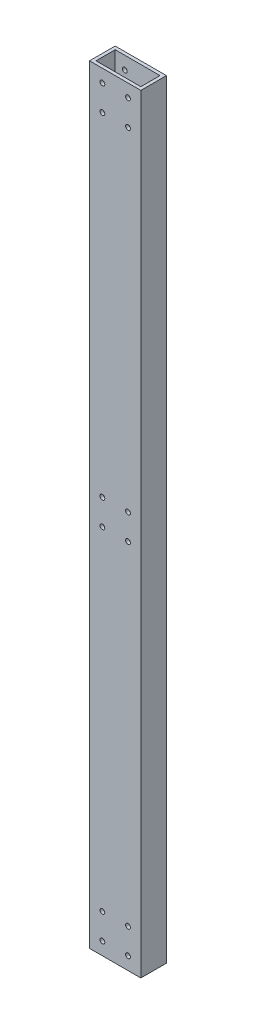
ISO-10303-21;
HEADER;
FILE_DESCRIPTION(('STEP AP214'),'2;1');
FILE_NAME('part.step','',(''),(''),'','','');
FILE_SCHEMA(('AUTOMOTIVE_DESIGN { 1 0 10303 214 1 1 1 1 }'));
ENDSEC;
DATA;
#1=APPLICATION_CONTEXT('core data for automotive mechanical design processes');
#2=APPLICATION_PROTOCOL_DEFINITION('international standard','automotive_design',2000,#1);
#3=PRODUCT_CONTEXT('',#1,'mechanical');
#4=PRODUCT('Part','Part','',(#3));
#5=PRODUCT_RELATED_PRODUCT_CATEGORY('part','',(#4));
#6=PRODUCT_DEFINITION_FORMATION('','',#4);
#7=PRODUCT_DEFINITION_CONTEXT('part definition',#1,'design');
#8=PRODUCT_DEFINITION('design','',#6,#7);
#9=PRODUCT_DEFINITION_SHAPE('','',#8);
#10=(LENGTH_UNIT() NAMED_UNIT(*) SI_UNIT(.MILLI.,.METRE.));
#11=(NAMED_UNIT(*) PLANE_ANGLE_UNIT() SI_UNIT($,.RADIAN.));
#12=(NAMED_UNIT(*) SI_UNIT($,.STERADIAN.) SOLID_ANGLE_UNIT());
#13=UNCERTAINTY_MEASURE_WITH_UNIT(LENGTH_MEASURE(1.E-05),#10,'distance_accuracy_value','');
#14=(GEOMETRIC_REPRESENTATION_CONTEXT(3) GLOBAL_UNCERTAINTY_ASSIGNED_CONTEXT((#13)) GLOBAL_UNIT_ASSIGNED_CONTEXT((#10,
#11,#12)) REPRESENTATION_CONTEXT('',''));
#15=CARTESIAN_POINT('',(0.,0.,0.));
#16=DIRECTION('',(0.,0.,1.));
#17=DIRECTION('',(1.,0.,0.));
#18=AXIS2_PLACEMENT_3D('',#15,#16,#17);
#19=CARTESIAN_POINT('',(0.,381.,0.));
#20=DIRECTION('',(0.,-1.,0.));
#21=DIRECTION('',(0.,0.,-1.));
#22=AXIS2_PLACEMENT_3D('',#19,#20,#21);
#23=PLANE('',#22);
#24=DIRECTION('',(0.,0.,1.));
#25=VECTOR('',#24,1.);
#26=CARTESIAN_POINT('',(-25.4,381.,-12.7));
#27=LINE('',#26,#25);
#28=CARTESIAN_POINT('',(-25.4,381.,-12.7));
#29=VERTEX_POINT('',#28);
#30=CARTESIAN_POINT('',(-25.4,381.,12.7));
#31=VERTEX_POINT('',#30);
#32=EDGE_CURVE('E137',#29,#31,#27,.T.);
#33=ORIENTED_EDGE('',*,*,#32,.T.);
#34=DIRECTION('',(1.,0.,0.));
#35=VECTOR('',#34,1.);
#36=CARTESIAN_POINT('',(25.4,381.,12.7));
#37=LINE('',#36,#35);
#38=CARTESIAN_POINT('',(25.4,381.,12.7));
#39=VERTEX_POINT('',#38);
#40=EDGE_CURVE('E140',#31,#39,#37,.T.);
#41=ORIENTED_EDGE('',*,*,#40,.T.);
#42=DIRECTION('',(0.,0.,-1.));
#43=VECTOR('',#42,1.);
#44=CARTESIAN_POINT('',(25.4,381.,-12.7));
#45=LINE('',#44,#43);
#46=CARTESIAN_POINT('',(25.4,381.,-12.7));
#47=VERTEX_POINT('',#46);
#48=EDGE_CURVE('E143',#39,#47,#45,.T.);
#49=ORIENTED_EDGE('',*,*,#48,.T.);
#50=DIRECTION('',(-1.,0.,0.));
#51=VECTOR('',#50,1.);
#52=CARTESIAN_POINT('',(25.4,381.,-12.7));
#53=LINE('',#52,#51);
#54=EDGE_CURVE('E145',#47,#29,#53,.T.);
#55=ORIENTED_EDGE('',*,*,#54,.T.);
#56=EDGE_LOOP('',(#33,#41,#49,#55));
#57=FACE_BOUND('',#56,.T.);
#58=DIRECTION('',(0.,0.,1.));
#59=VECTOR('',#58,1.);
#60=CARTESIAN_POINT('',(-22.225,381.,0.));
#61=LINE('',#60,#59);
#62=CARTESIAN_POINT('',(-22.225,381.,-9.52500000000001));
#63=VERTEX_POINT('',#62);
#64=CARTESIAN_POINT('',(-22.225,381.,9.52500000000001));
#65=VERTEX_POINT('',#64);
#66=EDGE_CURVE('E125',#63,#65,#61,.T.);
#67=ORIENTED_EDGE('',*,*,#66,.F.);
#68=DIRECTION('',(-1.,0.,0.));
#69=VECTOR('',#68,1.);
#70=CARTESIAN_POINT('',(0.,381.,-9.52500000000001));
#71=LINE('',#70,#69);
#72=CARTESIAN_POINT('',(22.225,381.,-9.52500000000001));
#73=VERTEX_POINT('',#72);
#74=EDGE_CURVE('E109',#73,#63,#71,.T.);
#75=ORIENTED_EDGE('',*,*,#74,.F.);
#76=DIRECTION('',(0.,0.,-1.));
#77=VECTOR('',#76,1.);
#78=CARTESIAN_POINT('',(22.225,381.,0.));
#79=LINE('',#78,#77);
#80=CARTESIAN_POINT('',(22.225,381.,9.52500000000001));
#81=VERTEX_POINT('',#80);
#82=EDGE_CURVE('E134',#81,#73,#79,.T.);
#83=ORIENTED_EDGE('',*,*,#82,.F.);
#84=DIRECTION('',(1.,0.,0.));
#85=VECTOR('',#84,1.);
#86=CARTESIAN_POINT('',(0.,381.,9.52500000000001));
#87=LINE('',#86,#85);
#88=EDGE_CURVE('E127',#65,#81,#87,.T.);
#89=ORIENTED_EDGE('',*,*,#88,.F.);
#90=EDGE_LOOP('',(#67,#75,#83,#89));
#91=FACE_BOUND('',#90,.T.);
#92=ADVANCED_FACE('F37',(#57,#91),#23,.F.);
#93=CARTESIAN_POINT('',(0.,-381.,0.));
#94=DIRECTION('',(0.,-1.,0.));
#95=DIRECTION('',(0.,0.,-1.));
#96=AXIS2_PLACEMENT_3D('',#93,#94,#95);
#97=PLANE('',#96);
#98=DIRECTION('',(0.,0.,1.));
#99=VECTOR('',#98,1.);
#100=CARTESIAN_POINT('',(-25.4,-381.,-12.7));
#101=LINE('',#100,#99);
#102=CARTESIAN_POINT('',(-25.4,-381.,-12.7));
#103=VERTEX_POINT('',#102);
#104=CARTESIAN_POINT('',(-25.4,-381.,12.7));
#105=VERTEX_POINT('',#104);
#106=EDGE_CURVE('E148',#103,#105,#101,.T.);
#107=ORIENTED_EDGE('',*,*,#106,.F.);
#108=DIRECTION('',(-1.,0.,0.));
#109=VECTOR('',#108,1.);
#110=CARTESIAN_POINT('',(25.4,-381.,-12.7));
#111=LINE('',#110,#109);
#112=CARTESIAN_POINT('',(25.4,-381.,-12.7));
#113=VERTEX_POINT('',#112);
#114=EDGE_CURVE('E141',#113,#103,#111,.T.);
#115=ORIENTED_EDGE('',*,*,#114,.F.);
#116=DIRECTION('',(0.,0.,-1.));
#117=VECTOR('',#116,1.);
#118=CARTESIAN_POINT('',(25.4,-381.,-12.7));
#119=LINE('',#118,#117);
#120=CARTESIAN_POINT('',(25.4,-381.,12.7));
#121=VERTEX_POINT('',#120);
#122=EDGE_CURVE('E153',#121,#113,#119,.T.);
#123=ORIENTED_EDGE('',*,*,#122,.F.);
#124=DIRECTION('',(1.,0.,0.));
#125=VECTOR('',#124,1.);
#126=CARTESIAN_POINT('',(25.4,-381.,12.7));
#127=LINE('',#126,#125);
#128=EDGE_CURVE('E151',#105,#121,#127,.T.);
#129=ORIENTED_EDGE('',*,*,#128,.F.);
#130=EDGE_LOOP('',(#107,#115,#123,#129));
#131=FACE_BOUND('',#130,.T.);
#132=DIRECTION('',(-1.,0.,0.));
#133=VECTOR('',#132,1.);
#134=CARTESIAN_POINT('',(0.,-381.,-9.52500000000001));
#135=LINE('',#134,#133);
#136=CARTESIAN_POINT('',(22.225,-381.,-9.52500000000001));
#137=VERTEX_POINT('',#136);
#138=CARTESIAN_POINT('',(-22.225,-381.,-9.52500000000001));
#139=VERTEX_POINT('',#138);
#140=EDGE_CURVE('E107',#137,#139,#135,.T.);
#141=ORIENTED_EDGE('',*,*,#140,.T.);
#142=DIRECTION('',(0.,0.,1.));
#143=VECTOR('',#142,1.);
#144=CARTESIAN_POINT('',(-22.225,-381.,0.));
#145=LINE('',#144,#143);
#146=CARTESIAN_POINT('',(-22.225,-381.,9.52500000000001));
#147=VERTEX_POINT('',#146);
#148=EDGE_CURVE('E115',#139,#147,#145,.T.);
#149=ORIENTED_EDGE('',*,*,#148,.T.);
#150=DIRECTION('',(1.,0.,0.));
#151=VECTOR('',#150,1.);
#152=CARTESIAN_POINT('',(0.,-381.,9.52500000000001));
#153=LINE('',#152,#151);
#154=CARTESIAN_POINT('',(22.225,-381.,9.52500000000001));
#155=VERTEX_POINT('',#154);
#156=EDGE_CURVE('E121',#147,#155,#153,.T.);
#157=ORIENTED_EDGE('',*,*,#156,.T.);
#158=DIRECTION('',(0.,0.,-1.));
#159=VECTOR('',#158,1.);
#160=CARTESIAN_POINT('',(22.225,-381.,0.));
#161=LINE('',#160,#159);
#162=EDGE_CURVE('E61',#155,#137,#161,.T.);
#163=ORIENTED_EDGE('',*,*,#162,.T.);
#164=EDGE_LOOP('',(#141,#149,#157,#163));
#165=FACE_BOUND('',#164,.T.);
#166=ADVANCED_FACE('F124',(#131,#165),#97,.T.);
#167=CARTESIAN_POINT('',(-25.4,381.,-12.7));
#168=DIRECTION('',(1.,0.,0.));
#169=DIRECTION('',(0.,0.,-1.));
#170=AXIS2_PLACEMENT_3D('',#167,#168,#169);
#171=PLANE('',#170);
#172=ORIENTED_EDGE('',*,*,#106,.T.);
#173=DIRECTION('',(0.,-1.,0.));
#174=VECTOR('',#173,1.);
#175=CARTESIAN_POINT('',(-25.4,381.,12.7));
#176=LINE('',#175,#174);
#177=EDGE_CURVE('E11',#31,#105,#176,.T.);
#178=ORIENTED_EDGE('',*,*,#177,.F.);
#179=ORIENTED_EDGE('',*,*,#32,.F.);
#180=DIRECTION('',(0.,-1.,0.));
#181=VECTOR('',#180,1.);
#182=CARTESIAN_POINT('',(-25.4,381.,-12.7));
#183=LINE('',#182,#181);
#184=EDGE_CURVE('E147',#29,#103,#183,.T.);
#185=ORIENTED_EDGE('',*,*,#184,.T.);
#186=EDGE_LOOP('',(#172,#178,#179,#185));
#187=FACE_BOUND('',#186,.T.);
#188=ADVANCED_FACE('F39',(#187),#171,.F.);
#189=CARTESIAN_POINT('',(25.4,381.,12.7));
#190=DIRECTION('',(0.,0.,-1.));
#191=DIRECTION('',(-1.,0.,0.));
#192=AXIS2_PLACEMENT_3D('',#189,#190,#191);
#193=PLANE('',#192);
#194=CARTESIAN_POINT('',(-12.7,12.7,12.7));
#195=DIRECTION('',(0.,0.,1.));
#196=DIRECTION('',(1.,0.,0.));
#197=AXIS2_PLACEMENT_3D('',#194,#195,#196);
#198=CIRCLE('',#197,2.38125);
#199=CARTESIAN_POINT('',(-10.31875,12.7,12.7));
#200=VERTEX_POINT('',#199);
#201=EDGE_CURVE('E265',#200,#200,#198,.T.);
#202=ORIENTED_EDGE('',*,*,#201,.F.);
#203=EDGE_LOOP('',(#202));
#204=FACE_BOUND('',#203,.T.);
#205=CARTESIAN_POINT('',(-12.7,-368.3,12.7));
#206=DIRECTION('',(0.,0.,1.));
#207=DIRECTION('',(-1.,0.,0.));
#208=AXIS2_PLACEMENT_3D('',#205,#206,#207);
#209=CIRCLE('',#208,2.38125000000003);
#210=CARTESIAN_POINT('',(-15.08125,-368.3,12.7));
#211=VERTEX_POINT('',#210);
#212=EDGE_CURVE('E269',#211,#211,#209,.T.);
#213=ORIENTED_EDGE('',*,*,#212,.F.);
#214=EDGE_LOOP('',(#213));
#215=FACE_BOUND('',#214,.T.);
#216=CARTESIAN_POINT('',(12.7,-368.3,12.7));
#217=DIRECTION('',(0.,0.,1.));
#218=DIRECTION('',(-1.,0.,0.));
#219=AXIS2_PLACEMENT_3D('',#216,#217,#218);
#220=CIRCLE('',#219,2.38125000000003);
#221=CARTESIAN_POINT('',(10.31875,-368.3,12.7));
#222=VERTEX_POINT('',#221);
#223=EDGE_CURVE('E273',#222,#222,#220,.T.);
#224=ORIENTED_EDGE('',*,*,#223,.F.);
#225=EDGE_LOOP('',(#224));
#226=FACE_BOUND('',#225,.T.);
#227=CARTESIAN_POINT('',(12.7,-342.9,12.7));
#228=DIRECTION('',(0.,0.,1.));
#229=DIRECTION('',(-1.,0.,0.));
#230=AXIS2_PLACEMENT_3D('',#227,#228,#229);
#231=CIRCLE('',#230,2.38125000000003);
#232=CARTESIAN_POINT('',(10.31875,-342.9,12.7));
#233=VERTEX_POINT('',#232);
#234=EDGE_CURVE('E277',#233,#233,#231,.T.);
#235=ORIENTED_EDGE('',*,*,#234,.F.);
#236=EDGE_LOOP('',(#235));
#237=FACE_BOUND('',#236,.T.);
#238=CARTESIAN_POINT('',(-12.7,-342.9,12.7));
#239=DIRECTION('',(0.,0.,1.));
#240=DIRECTION('',(-1.,0.,0.));
#241=AXIS2_PLACEMENT_3D('',#238,#239,#240);
#242=CIRCLE('',#241,2.38125000000003);
#243=CARTESIAN_POINT('',(-15.08125,-342.9,12.7));
#244=VERTEX_POINT('',#243);
#245=EDGE_CURVE('E281',#244,#244,#242,.T.);
#246=ORIENTED_EDGE('',*,*,#245,.F.);
#247=EDGE_LOOP('',(#246));
#248=FACE_BOUND('',#247,.T.);
#249=CARTESIAN_POINT('',(-12.7,342.9,12.7));
#250=DIRECTION('',(0.,0.,1.));
#251=DIRECTION('',(1.,0.,0.));
#252=AXIS2_PLACEMENT_3D('',#249,#250,#251);
#253=CIRCLE('',#252,2.38125000000003);
#254=CARTESIAN_POINT('',(-10.31875,342.9,12.7));
#255=VERTEX_POINT('',#254);
#256=EDGE_CURVE('E285',#255,#255,#253,.T.);
#257=ORIENTED_EDGE('',*,*,#256,.F.);
#258=EDGE_LOOP('',(#257));
#259=FACE_BOUND('',#258,.T.);
#260=CARTESIAN_POINT('',(12.7,342.9,12.7));
#261=DIRECTION('',(0.,0.,1.));
#262=DIRECTION('',(1.,0.,0.));
#263=AXIS2_PLACEMENT_3D('',#260,#261,#262);
#264=CIRCLE('',#263,2.38125000000003);
#265=CARTESIAN_POINT('',(15.08125,342.9,12.7));
#266=VERTEX_POINT('',#265);
#267=EDGE_CURVE('E289',#266,#266,#264,.T.);
#268=ORIENTED_EDGE('',*,*,#267,.F.);
#269=EDGE_LOOP('',(#268));
#270=FACE_BOUND('',#269,.T.);
#271=CARTESIAN_POINT('',(12.7,368.3,12.7));
#272=DIRECTION('',(0.,0.,1.));
#273=DIRECTION('',(1.,0.,0.));
#274=AXIS2_PLACEMENT_3D('',#271,#272,#273);
#275=CIRCLE('',#274,2.38125000000003);
#276=CARTESIAN_POINT('',(15.08125,368.3,12.7));
#277=VERTEX_POINT('',#276);
#278=EDGE_CURVE('E293',#277,#277,#275,.T.);
#279=ORIENTED_EDGE('',*,*,#278,.F.);
#280=EDGE_LOOP('',(#279));
#281=FACE_BOUND('',#280,.T.);
#282=CARTESIAN_POINT('',(12.7,12.7,12.7));
#283=DIRECTION('',(0.,0.,1.));
#284=DIRECTION('',(1.,0.,0.));
#285=AXIS2_PLACEMENT_3D('',#282,#283,#284);
#286=CIRCLE('',#285,2.38125);
#287=CARTESIAN_POINT('',(15.08125,12.7,12.7));
#288=VERTEX_POINT('',#287);
#289=EDGE_CURVE('E297',#288,#288,#286,.T.);
#290=ORIENTED_EDGE('',*,*,#289,.F.);
#291=EDGE_LOOP('',(#290));
#292=FACE_BOUND('',#291,.T.);
#293=CARTESIAN_POINT('',(12.7,-12.7,12.7));
#294=DIRECTION('',(0.,0.,1.));
#295=DIRECTION('',(-1.,0.,0.));
#296=AXIS2_PLACEMENT_3D('',#293,#294,#295);
#297=CIRCLE('',#296,2.38125);
#298=CARTESIAN_POINT('',(10.31875,-12.7,12.7));
#299=VERTEX_POINT('',#298);
#300=EDGE_CURVE('E301',#299,#299,#297,.T.);
#301=ORIENTED_EDGE('',*,*,#300,.F.);
#302=EDGE_LOOP('',(#301));
#303=FACE_BOUND('',#302,.T.);
#304=CARTESIAN_POINT('',(-12.7,-12.7,12.7));
#305=DIRECTION('',(0.,0.,1.));
#306=DIRECTION('',(-1.,0.,0.));
#307=AXIS2_PLACEMENT_3D('',#304,#305,#306);
#308=CIRCLE('',#307,2.38125);
#309=CARTESIAN_POINT('',(-15.08125,-12.7,12.7));
#310=VERTEX_POINT('',#309);
#311=EDGE_CURVE('E305',#310,#310,#308,.T.);
#312=ORIENTED_EDGE('',*,*,#311,.F.);
#313=EDGE_LOOP('',(#312));
#314=FACE_BOUND('',#313,.T.);
#315=CARTESIAN_POINT('',(-12.7,368.3,12.7));
#316=DIRECTION('',(0.,0.,1.));
#317=DIRECTION('',(1.,0.,0.));
#318=AXIS2_PLACEMENT_3D('',#315,#316,#317);
#319=CIRCLE('',#318,2.38125000000003);
#320=CARTESIAN_POINT('',(-10.31875,368.3,12.7));
#321=VERTEX_POINT('',#320);
#322=EDGE_CURVE('E309',#321,#321,#319,.T.);
#323=ORIENTED_EDGE('',*,*,#322,.F.);
#324=EDGE_LOOP('',(#323));
#325=FACE_BOUND('',#324,.T.);
#326=ORIENTED_EDGE('',*,*,#128,.T.);
#327=DIRECTION('',(0.,-1.,0.));
#328=VECTOR('',#327,1.);
#329=CARTESIAN_POINT('',(25.4,381.,12.7));
#330=LINE('',#329,#328);
#331=EDGE_CURVE('E46',#39,#121,#330,.T.);
#332=ORIENTED_EDGE('',*,*,#331,.F.);
#333=ORIENTED_EDGE('',*,*,#40,.F.);
#334=ORIENTED_EDGE('',*,*,#177,.T.);
#335=EDGE_LOOP('',(#326,#332,#333,#334));
#336=FACE_BOUND('',#335,.T.);
#337=ADVANCED_FACE('F254',(#204,#215,#226,#237,#248,#259,#270,#281,#292,#303,#314,#325,#336),
#193,.F.);
#338=CARTESIAN_POINT('',(25.4,381.,-12.7));
#339=DIRECTION('',(-1.,0.,0.));
#340=DIRECTION('',(0.,0.,1.));
#341=AXIS2_PLACEMENT_3D('',#338,#339,#340);
#342=PLANE('',#341);
#343=ORIENTED_EDGE('',*,*,#122,.T.);
#344=DIRECTION('',(0.,-1.,0.));
#345=VECTOR('',#344,1.);
#346=CARTESIAN_POINT('',(25.4,381.,-12.7));
#347=LINE('',#346,#345);
#348=EDGE_CURVE('E158',#47,#113,#347,.T.);
#349=ORIENTED_EDGE('',*,*,#348,.F.);
#350=ORIENTED_EDGE('',*,*,#48,.F.);
#351=ORIENTED_EDGE('',*,*,#331,.T.);
#352=EDGE_LOOP('',(#343,#349,#350,#351));
#353=FACE_BOUND('',#352,.T.);
#354=ADVANCED_FACE('F251',(#353),#342,.F.);
#355=CARTESIAN_POINT('',(25.4,381.,-12.7));
#356=DIRECTION('',(0.,0.,1.));
#357=DIRECTION('',(1.,0.,0.));
#358=AXIS2_PLACEMENT_3D('',#355,#356,#357);
#359=PLANE('',#358);
#360=CARTESIAN_POINT('',(-12.7,12.7,-12.7));
#361=DIRECTION('',(0.,0.,1.));
#362=DIRECTION('',(1.,0.,0.));
#363=AXIS2_PLACEMENT_3D('',#360,#361,#362);
#364=CIRCLE('',#363,2.38125);
#365=CARTESIAN_POINT('',(-10.31875,12.7,-12.7));
#366=VERTEX_POINT('',#365);
#367=EDGE_CURVE('E443',#366,#366,#364,.T.);
#368=ORIENTED_EDGE('',*,*,#367,.T.);
#369=EDGE_LOOP('',(#368));
#370=FACE_BOUND('',#369,.T.);
#371=CARTESIAN_POINT('',(-12.7,-368.3,-12.7));
#372=DIRECTION('',(0.,0.,1.));
#373=DIRECTION('',(-1.,0.,0.));
#374=AXIS2_PLACEMENT_3D('',#371,#372,#373);
#375=CIRCLE('',#374,2.38125000000003);
#376=CARTESIAN_POINT('',(-15.08125,-368.3,-12.7));
#377=VERTEX_POINT('',#376);
#378=EDGE_CURVE('E439',#377,#377,#375,.T.);
#379=ORIENTED_EDGE('',*,*,#378,.T.);
#380=EDGE_LOOP('',(#379));
#381=FACE_BOUND('',#380,.T.);
#382=CARTESIAN_POINT('',(12.7,-368.3,-12.7));
#383=DIRECTION('',(0.,0.,1.));
#384=DIRECTION('',(-1.,0.,0.));
#385=AXIS2_PLACEMENT_3D('',#382,#383,#384);
#386=CIRCLE('',#385,2.38125000000003);
#387=CARTESIAN_POINT('',(10.31875,-368.3,-12.7));
#388=VERTEX_POINT('',#387);
#389=EDGE_CURVE('E435',#388,#388,#386,.T.);
#390=ORIENTED_EDGE('',*,*,#389,.T.);
#391=EDGE_LOOP('',(#390));
#392=FACE_BOUND('',#391,.T.);
#393=CARTESIAN_POINT('',(12.7,-342.9,-12.7));
#394=DIRECTION('',(0.,0.,1.));
#395=DIRECTION('',(-1.,0.,0.));
#396=AXIS2_PLACEMENT_3D('',#393,#394,#395);
#397=CIRCLE('',#396,2.38125000000003);
#398=CARTESIAN_POINT('',(10.31875,-342.9,-12.7));
#399=VERTEX_POINT('',#398);
#400=EDGE_CURVE('E431',#399,#399,#397,.T.);
#401=ORIENTED_EDGE('',*,*,#400,.T.);
#402=EDGE_LOOP('',(#401));
#403=FACE_BOUND('',#402,.T.);
#404=CARTESIAN_POINT('',(-12.7,-342.9,-12.7));
#405=DIRECTION('',(0.,0.,1.));
#406=DIRECTION('',(-1.,0.,0.));
#407=AXIS2_PLACEMENT_3D('',#404,#405,#406);
#408=CIRCLE('',#407,2.38125000000003);
#409=CARTESIAN_POINT('',(-15.08125,-342.9,-12.7));
#410=VERTEX_POINT('',#409);
#411=EDGE_CURVE('E430',#410,#410,#408,.T.);
#412=ORIENTED_EDGE('',*,*,#411,.T.);
#413=EDGE_LOOP('',(#412));
#414=FACE_BOUND('',#413,.T.);
#415=CARTESIAN_POINT('',(-12.7,342.9,-12.7));
#416=DIRECTION('',(0.,0.,1.));
#417=DIRECTION('',(1.,0.,0.));
#418=AXIS2_PLACEMENT_3D('',#415,#416,#417);
#419=CIRCLE('',#418,2.38125000000003);
#420=CARTESIAN_POINT('',(-10.31875,342.9,-12.7));
#421=VERTEX_POINT('',#420);
#422=EDGE_CURVE('E453',#421,#421,#419,.T.);
#423=ORIENTED_EDGE('',*,*,#422,.T.);
#424=EDGE_LOOP('',(#423));
#425=FACE_BOUND('',#424,.T.);
#426=CARTESIAN_POINT('',(12.7,342.9,-12.7));
#427=DIRECTION('',(0.,0.,1.));
#428=DIRECTION('',(1.,0.,0.));
#429=AXIS2_PLACEMENT_3D('',#426,#427,#428);
#430=CIRCLE('',#429,2.38125000000003);
#431=CARTESIAN_POINT('',(15.08125,342.9,-12.7));
#432=VERTEX_POINT('',#431);
#433=EDGE_CURVE('E449',#432,#432,#430,.T.);
#434=ORIENTED_EDGE('',*,*,#433,.T.);
#435=EDGE_LOOP('',(#434));
#436=FACE_BOUND('',#435,.T.);
#437=CARTESIAN_POINT('',(12.7,368.3,-12.7));
#438=DIRECTION('',(0.,0.,1.));
#439=DIRECTION('',(1.,0.,0.));
#440=AXIS2_PLACEMENT_3D('',#437,#438,#439);
#441=CIRCLE('',#440,2.38125000000003);
#442=CARTESIAN_POINT('',(15.08125,368.3,-12.7));
#443=VERTEX_POINT('',#442);
#444=EDGE_CURVE('E325',#443,#443,#441,.T.);
#445=ORIENTED_EDGE('',*,*,#444,.T.);
#446=EDGE_LOOP('',(#445));
#447=FACE_BOUND('',#446,.T.);
#448=CARTESIAN_POINT('',(12.7,12.7,-12.7));
#449=DIRECTION('',(0.,0.,1.));
#450=DIRECTION('',(1.,0.,0.));
#451=AXIS2_PLACEMENT_3D('',#448,#449,#450);
#452=CIRCLE('',#451,2.38125);
#453=CARTESIAN_POINT('',(15.08125,12.7,-12.7));
#454=VERTEX_POINT('',#453);
#455=EDGE_CURVE('E526',#454,#454,#452,.T.);
#456=ORIENTED_EDGE('',*,*,#455,.T.);
#457=EDGE_LOOP('',(#456));
#458=FACE_BOUND('',#457,.T.);
#459=CARTESIAN_POINT('',(12.7,-12.7,-12.7));
#460=DIRECTION('',(0.,0.,1.));
#461=DIRECTION('',(-1.,0.,0.));
#462=AXIS2_PLACEMENT_3D('',#459,#460,#461);
#463=CIRCLE('',#462,2.38125);
#464=CARTESIAN_POINT('',(10.31875,-12.7,-12.7));
#465=VERTEX_POINT('',#464);
#466=EDGE_CURVE('E425',#465,#465,#463,.T.);
#467=ORIENTED_EDGE('',*,*,#466,.T.);
#468=EDGE_LOOP('',(#467));
#469=FACE_BOUND('',#468,.T.);
#470=CARTESIAN_POINT('',(-12.7,-12.7,-12.7));
#471=DIRECTION('',(0.,0.,1.));
#472=DIRECTION('',(-1.,0.,0.));
#473=AXIS2_PLACEMENT_3D('',#470,#471,#472);
#474=CIRCLE('',#473,2.38125);
#475=CARTESIAN_POINT('',(-15.08125,-12.7,-12.7));
#476=VERTEX_POINT('',#475);
#477=EDGE_CURVE('E422',#476,#476,#474,.T.);
#478=ORIENTED_EDGE('',*,*,#477,.T.);
#479=EDGE_LOOP('',(#478));
#480=FACE_BOUND('',#479,.T.);
#481=CARTESIAN_POINT('',(-12.7,368.3,-12.7));
#482=DIRECTION('',(0.,0.,1.));
#483=DIRECTION('',(1.,0.,0.));
#484=AXIS2_PLACEMENT_3D('',#481,#482,#483);
#485=CIRCLE('',#484,2.38125000000003);
#486=CARTESIAN_POINT('',(-10.31875,368.3,-12.7));
#487=VERTEX_POINT('',#486);
#488=EDGE_CURVE('E167',#487,#487,#485,.T.);
#489=ORIENTED_EDGE('',*,*,#488,.T.);
#490=EDGE_LOOP('',(#489));
#491=FACE_BOUND('',#490,.T.);
#492=ORIENTED_EDGE('',*,*,#114,.T.);
#493=ORIENTED_EDGE('',*,*,#184,.F.);
#494=ORIENTED_EDGE('',*,*,#54,.F.);
#495=ORIENTED_EDGE('',*,*,#348,.T.);
#496=EDGE_LOOP('',(#492,#493,#494,#495));
#497=FACE_BOUND('',#496,.T.);
#498=ADVANCED_FACE('F235',(#370,#381,#392,#403,#414,#425,#436,#447,#458,#469,#480,#491,#497),
#359,.F.);
#499=CARTESIAN_POINT('',(-22.225,381.,-12.7));
#500=DIRECTION('',(1.,0.,0.));
#501=DIRECTION('',(0.,0.,-1.));
#502=AXIS2_PLACEMENT_3D('',#499,#500,#501);
#503=PLANE('',#502);
#504=ORIENTED_EDGE('',*,*,#148,.F.);
#505=DIRECTION('',(0.,-1.,0.));
#506=VECTOR('',#505,1.);
#507=CARTESIAN_POINT('',(-22.225,381.,-9.52500000000001));
#508=LINE('',#507,#506);
#509=EDGE_CURVE('E103',#63,#139,#508,.T.);
#510=ORIENTED_EDGE('',*,*,#509,.F.);
#511=ORIENTED_EDGE('',*,*,#66,.T.);
#512=DIRECTION('',(0.,-1.,0.));
#513=VECTOR('',#512,1.);
#514=CARTESIAN_POINT('',(-22.225,381.,9.52500000000001));
#515=LINE('',#514,#513);
#516=EDGE_CURVE('E118',#65,#147,#515,.T.);
#517=ORIENTED_EDGE('',*,*,#516,.T.);
#518=EDGE_LOOP('',(#504,#510,#511,#517));
#519=FACE_BOUND('',#518,.T.);
#520=ADVANCED_FACE('F116',(#519),#503,.T.);
#521=CARTESIAN_POINT('',(25.4,381.,9.52500000000001));
#522=DIRECTION('',(0.,0.,-1.));
#523=DIRECTION('',(-1.,0.,0.));
#524=AXIS2_PLACEMENT_3D('',#521,#522,#523);
#525=PLANE('',#524);
#526=CARTESIAN_POINT('',(-12.7,12.7,9.52500000000001));
#527=DIRECTION('',(0.,0.,-1.));
#528=DIRECTION('',(-1.,0.,0.));
#529=AXIS2_PLACEMENT_3D('',#526,#527,#528);
#530=CIRCLE('',#529,2.38125);
#531=CARTESIAN_POINT('',(-15.08125,12.7,9.52500000000001));
#532=VERTEX_POINT('',#531);
#533=EDGE_CURVE('E122',#532,#532,#530,.T.);
#534=ORIENTED_EDGE('',*,*,#533,.F.);
#535=EDGE_LOOP('',(#534));
#536=FACE_BOUND('',#535,.T.);
#537=CARTESIAN_POINT('',(-12.7,-368.3,9.52500000000001));
#538=DIRECTION('',(0.,0.,-1.));
#539=DIRECTION('',(-1.,0.,0.));
#540=AXIS2_PLACEMENT_3D('',#537,#538,#539);
#541=CIRCLE('',#540,2.38125000000003);
#542=CARTESIAN_POINT('',(-15.08125,-368.3,9.52500000000001));
#543=VERTEX_POINT('',#542);
#544=EDGE_CURVE('E205',#543,#543,#541,.T.);
#545=ORIENTED_EDGE('',*,*,#544,.F.);
#546=EDGE_LOOP('',(#545));
#547=FACE_BOUND('',#546,.T.);
#548=CARTESIAN_POINT('',(12.7,-368.3,9.52500000000001));
#549=DIRECTION('',(0.,0.,-1.));
#550=DIRECTION('',(-1.,0.,0.));
#551=AXIS2_PLACEMENT_3D('',#548,#549,#550);
#552=CIRCLE('',#551,2.38125000000003);
#553=CARTESIAN_POINT('',(10.31875,-368.3,9.52500000000001));
#554=VERTEX_POINT('',#553);
#555=EDGE_CURVE('E202',#554,#554,#552,.T.);
#556=ORIENTED_EDGE('',*,*,#555,.F.);
#557=EDGE_LOOP('',(#556));
#558=FACE_BOUND('',#557,.T.);
#559=CARTESIAN_POINT('',(12.7,-342.9,9.52500000000001));
#560=DIRECTION('',(0.,0.,-1.));
#561=DIRECTION('',(-1.,0.,0.));
#562=AXIS2_PLACEMENT_3D('',#559,#560,#561);
#563=CIRCLE('',#562,2.38125000000003);
#564=CARTESIAN_POINT('',(10.31875,-342.9,9.52500000000001));
#565=VERTEX_POINT('',#564);
#566=EDGE_CURVE('E199',#565,#565,#563,.T.);
#567=ORIENTED_EDGE('',*,*,#566,.F.);
#568=EDGE_LOOP('',(#567));
#569=FACE_BOUND('',#568,.T.);
#570=CARTESIAN_POINT('',(-12.7,-342.9,9.52500000000001));
#571=DIRECTION('',(0.,0.,-1.));
#572=DIRECTION('',(-1.,0.,0.));
#573=AXIS2_PLACEMENT_3D('',#570,#571,#572);
#574=CIRCLE('',#573,2.38125000000003);
#575=CARTESIAN_POINT('',(-15.08125,-342.9,9.52500000000001));
#576=VERTEX_POINT('',#575);
#577=EDGE_CURVE('E195',#576,#576,#574,.T.);
#578=ORIENTED_EDGE('',*,*,#577,.F.);
#579=EDGE_LOOP('',(#578));
#580=FACE_BOUND('',#579,.T.);
#581=CARTESIAN_POINT('',(-12.7,342.9,9.52500000000001));
#582=DIRECTION('',(0.,0.,-1.));
#583=DIRECTION('',(-1.,0.,0.));
#584=AXIS2_PLACEMENT_3D('',#581,#582,#583);
#585=CIRCLE('',#584,2.38125000000003);
#586=CARTESIAN_POINT('',(-15.08125,342.9,9.52500000000001));
#587=VERTEX_POINT('',#586);
#588=EDGE_CURVE('E191',#587,#587,#585,.T.);
#589=ORIENTED_EDGE('',*,*,#588,.F.);
#590=EDGE_LOOP('',(#589));
#591=FACE_BOUND('',#590,.T.);
#592=CARTESIAN_POINT('',(12.7,342.9,9.52500000000001));
#593=DIRECTION('',(0.,0.,-1.));
#594=DIRECTION('',(-1.,0.,0.));
#595=AXIS2_PLACEMENT_3D('',#592,#593,#594);
#596=CIRCLE('',#595,2.38125000000003);
#597=CARTESIAN_POINT('',(10.31875,342.9,9.52500000000001));
#598=VERTEX_POINT('',#597);
#599=EDGE_CURVE('E187',#598,#598,#596,.T.);
#600=ORIENTED_EDGE('',*,*,#599,.F.);
#601=EDGE_LOOP('',(#600));
#602=FACE_BOUND('',#601,.T.);
#603=CARTESIAN_POINT('',(12.7,368.3,9.52500000000001));
#604=DIRECTION('',(0.,0.,-1.));
#605=DIRECTION('',(-1.,0.,0.));
#606=AXIS2_PLACEMENT_3D('',#603,#604,#605);
#607=CIRCLE('',#606,2.38125000000003);
#608=CARTESIAN_POINT('',(10.31875,368.3,9.52500000000001));
#609=VERTEX_POINT('',#608);
#610=EDGE_CURVE('E183',#609,#609,#607,.T.);
#611=ORIENTED_EDGE('',*,*,#610,.F.);
#612=EDGE_LOOP('',(#611));
#613=FACE_BOUND('',#612,.T.);
#614=CARTESIAN_POINT('',(12.7,12.7,9.52500000000001));
#615=DIRECTION('',(0.,0.,-1.));
#616=DIRECTION('',(-1.,0.,0.));
#617=AXIS2_PLACEMENT_3D('',#614,#615,#616);
#618=CIRCLE('',#617,2.38125);
#619=CARTESIAN_POINT('',(10.31875,12.7,9.52500000000001));
#620=VERTEX_POINT('',#619);
#621=EDGE_CURVE('E179',#620,#620,#618,.T.);
#622=ORIENTED_EDGE('',*,*,#621,.F.);
#623=EDGE_LOOP('',(#622));
#624=FACE_BOUND('',#623,.T.);
#625=CARTESIAN_POINT('',(12.7,-12.7,9.52500000000001));
#626=DIRECTION('',(0.,0.,-1.));
#627=DIRECTION('',(-1.,0.,0.));
#628=AXIS2_PLACEMENT_3D('',#625,#626,#627);
#629=CIRCLE('',#628,2.38125);
#630=CARTESIAN_POINT('',(10.31875,-12.7,9.52500000000001));
#631=VERTEX_POINT('',#630);
#632=EDGE_CURVE('E175',#631,#631,#629,.T.);
#633=ORIENTED_EDGE('',*,*,#632,.F.);
#634=EDGE_LOOP('',(#633));
#635=FACE_BOUND('',#634,.T.);
#636=CARTESIAN_POINT('',(-12.7,-12.7,9.52500000000001));
#637=DIRECTION('',(0.,0.,-1.));
#638=DIRECTION('',(-1.,0.,0.));
#639=AXIS2_PLACEMENT_3D('',#636,#637,#638);
#640=CIRCLE('',#639,2.38125);
#641=CARTESIAN_POINT('',(-15.08125,-12.7,9.52500000000001));
#642=VERTEX_POINT('',#641);
#643=EDGE_CURVE('E171',#642,#642,#640,.T.);
#644=ORIENTED_EDGE('',*,*,#643,.F.);
#645=EDGE_LOOP('',(#644));
#646=FACE_BOUND('',#645,.T.);
#647=CARTESIAN_POINT('',(-12.7,368.3,9.52500000000001));
#648=DIRECTION('',(0.,0.,-1.));
#649=DIRECTION('',(-1.,0.,0.));
#650=AXIS2_PLACEMENT_3D('',#647,#648,#649);
#651=CIRCLE('',#650,2.38125000000003);
#652=CARTESIAN_POINT('',(-15.08125,368.3,9.52500000000001));
#653=VERTEX_POINT('',#652);
#654=EDGE_CURVE('E166',#653,#653,#651,.T.);
#655=ORIENTED_EDGE('',*,*,#654,.F.);
#656=EDGE_LOOP('',(#655));
#657=FACE_BOUND('',#656,.T.);
#658=ORIENTED_EDGE('',*,*,#156,.F.);
#659=ORIENTED_EDGE('',*,*,#516,.F.);
#660=ORIENTED_EDGE('',*,*,#88,.T.);
#661=DIRECTION('',(0.,-1.,0.));
#662=VECTOR('',#661,1.);
#663=CARTESIAN_POINT('',(22.225,381.,9.52500000000001));
#664=LINE('',#663,#662);
#665=EDGE_CURVE('E219',#81,#155,#664,.T.);
#666=ORIENTED_EDGE('',*,*,#665,.T.);
#667=EDGE_LOOP('',(#658,#659,#660,#666));
#668=FACE_BOUND('',#667,.T.);
#669=ADVANCED_FACE('F226',(#536,#547,#558,#569,#580,#591,#602,#613,#624,#635,#646,#657,#668),
#525,.T.);
#670=CARTESIAN_POINT('',(22.225,381.,-12.7));
#671=DIRECTION('',(-1.,0.,0.));
#672=DIRECTION('',(0.,0.,1.));
#673=AXIS2_PLACEMENT_3D('',#670,#671,#672);
#674=PLANE('',#673);
#675=ORIENTED_EDGE('',*,*,#162,.F.);
#676=ORIENTED_EDGE('',*,*,#665,.F.);
#677=ORIENTED_EDGE('',*,*,#82,.T.);
#678=DIRECTION('',(0.,-1.,0.));
#679=VECTOR('',#678,1.);
#680=CARTESIAN_POINT('',(22.225,381.,-9.52500000000001));
#681=LINE('',#680,#679);
#682=EDGE_CURVE('E54',#73,#137,#681,.T.);
#683=ORIENTED_EDGE('',*,*,#682,.T.);
#684=EDGE_LOOP('',(#675,#676,#677,#683));
#685=FACE_BOUND('',#684,.T.);
#686=ADVANCED_FACE('F221',(#685),#674,.T.);
#687=CARTESIAN_POINT('',(25.4,381.,-9.52500000000001));
#688=DIRECTION('',(0.,0.,1.));
#689=DIRECTION('',(1.,0.,0.));
#690=AXIS2_PLACEMENT_3D('',#687,#688,#689);
#691=PLANE('',#690);
#692=CARTESIAN_POINT('',(-12.7,12.7,-9.52500000000001));
#693=DIRECTION('',(0.,0.,1.));
#694=DIRECTION('',(1.,0.,0.));
#695=AXIS2_PLACEMENT_3D('',#692,#693,#694);
#696=CIRCLE('',#695,2.38125);
#697=CARTESIAN_POINT('',(-10.31875,12.7,-9.52500000000001));
#698=VERTEX_POINT('',#697);
#699=EDGE_CURVE('E41',#698,#698,#696,.T.);
#700=ORIENTED_EDGE('',*,*,#699,.F.);
#701=EDGE_LOOP('',(#700));
#702=FACE_BOUND('',#701,.T.);
#703=CARTESIAN_POINT('',(-12.7,-368.3,-9.52500000000001));
#704=DIRECTION('',(0.,0.,1.));
#705=DIRECTION('',(1.,0.,0.));
#706=AXIS2_PLACEMENT_3D('',#703,#704,#705);
#707=CIRCLE('',#706,2.38125000000003);
#708=CARTESIAN_POINT('',(-10.31875,-368.3,-9.52500000000001));
#709=VERTEX_POINT('',#708);
#710=EDGE_CURVE('E203',#709,#709,#707,.T.);
#711=ORIENTED_EDGE('',*,*,#710,.F.);
#712=EDGE_LOOP('',(#711));
#713=FACE_BOUND('',#712,.T.);
#714=CARTESIAN_POINT('',(12.7,-368.3,-9.52500000000001));
#715=DIRECTION('',(0.,0.,1.));
#716=DIRECTION('',(1.,0.,0.));
#717=AXIS2_PLACEMENT_3D('',#714,#715,#716);
#718=CIRCLE('',#717,2.38125000000003);
#719=CARTESIAN_POINT('',(15.08125,-368.3,-9.52500000000001));
#720=VERTEX_POINT('',#719);
#721=EDGE_CURVE('E200',#720,#720,#718,.T.);
#722=ORIENTED_EDGE('',*,*,#721,.F.);
#723=EDGE_LOOP('',(#722));
#724=FACE_BOUND('',#723,.T.);
#725=CARTESIAN_POINT('',(12.7,-342.9,-9.52500000000001));
#726=DIRECTION('',(0.,0.,1.));
#727=DIRECTION('',(1.,0.,0.));
#728=AXIS2_PLACEMENT_3D('',#725,#726,#727);
#729=CIRCLE('',#728,2.38125000000003);
#730=CARTESIAN_POINT('',(15.08125,-342.9,-9.52500000000001));
#731=VERTEX_POINT('',#730);
#732=EDGE_CURVE('E196',#731,#731,#729,.T.);
#733=ORIENTED_EDGE('',*,*,#732,.F.);
#734=EDGE_LOOP('',(#733));
#735=FACE_BOUND('',#734,.T.);
#736=CARTESIAN_POINT('',(-12.7,-342.9,-9.52500000000001));
#737=DIRECTION('',(0.,0.,1.));
#738=DIRECTION('',(1.,0.,0.));
#739=AXIS2_PLACEMENT_3D('',#736,#737,#738);
#740=CIRCLE('',#739,2.38125000000003);
#741=CARTESIAN_POINT('',(-10.31875,-342.9,-9.52500000000001));
#742=VERTEX_POINT('',#741);
#743=EDGE_CURVE('E192',#742,#742,#740,.T.);
#744=ORIENTED_EDGE('',*,*,#743,.F.);
#745=EDGE_LOOP('',(#744));
#746=FACE_BOUND('',#745,.T.);
#747=CARTESIAN_POINT('',(-12.7,342.9,-9.52500000000001));
#748=DIRECTION('',(0.,0.,1.));
#749=DIRECTION('',(1.,0.,0.));
#750=AXIS2_PLACEMENT_3D('',#747,#748,#749);
#751=CIRCLE('',#750,2.38125000000003);
#752=CARTESIAN_POINT('',(-10.31875,342.9,-9.52500000000001));
#753=VERTEX_POINT('',#752);
#754=EDGE_CURVE('E188',#753,#753,#751,.T.);
#755=ORIENTED_EDGE('',*,*,#754,.F.);
#756=EDGE_LOOP('',(#755));
#757=FACE_BOUND('',#756,.T.);
#758=CARTESIAN_POINT('',(12.7,342.9,-9.52500000000001));
#759=DIRECTION('',(0.,0.,1.));
#760=DIRECTION('',(1.,0.,0.));
#761=AXIS2_PLACEMENT_3D('',#758,#759,#760);
#762=CIRCLE('',#761,2.38125000000003);
#763=CARTESIAN_POINT('',(15.08125,342.9,-9.52500000000001));
#764=VERTEX_POINT('',#763);
#765=EDGE_CURVE('E184',#764,#764,#762,.T.);
#766=ORIENTED_EDGE('',*,*,#765,.F.);
#767=EDGE_LOOP('',(#766));
#768=FACE_BOUND('',#767,.T.);
#769=CARTESIAN_POINT('',(12.7,368.3,-9.52500000000001));
#770=DIRECTION('',(0.,0.,1.));
#771=DIRECTION('',(1.,0.,0.));
#772=AXIS2_PLACEMENT_3D('',#769,#770,#771);
#773=CIRCLE('',#772,2.38125000000003);
#774=CARTESIAN_POINT('',(15.08125,368.3,-9.52500000000001));
#775=VERTEX_POINT('',#774);
#776=EDGE_CURVE('E180',#775,#775,#773,.T.);
#777=ORIENTED_EDGE('',*,*,#776,.F.);
#778=EDGE_LOOP('',(#777));
#779=FACE_BOUND('',#778,.T.);
#780=CARTESIAN_POINT('',(12.7,12.7,-9.52500000000001));
#781=DIRECTION('',(0.,0.,1.));
#782=DIRECTION('',(1.,0.,0.));
#783=AXIS2_PLACEMENT_3D('',#780,#781,#782);
#784=CIRCLE('',#783,2.38125);
#785=CARTESIAN_POINT('',(15.08125,12.7,-9.52500000000001));
#786=VERTEX_POINT('',#785);
#787=EDGE_CURVE('E176',#786,#786,#784,.T.);
#788=ORIENTED_EDGE('',*,*,#787,.F.);
#789=EDGE_LOOP('',(#788));
#790=FACE_BOUND('',#789,.T.);
#791=CARTESIAN_POINT('',(12.7,-12.7,-9.52500000000001));
#792=DIRECTION('',(0.,0.,1.));
#793=DIRECTION('',(1.,0.,0.));
#794=AXIS2_PLACEMENT_3D('',#791,#792,#793);
#795=CIRCLE('',#794,2.38125);
#796=CARTESIAN_POINT('',(15.08125,-12.7,-9.52500000000001));
#797=VERTEX_POINT('',#796);
#798=EDGE_CURVE('E172',#797,#797,#795,.T.);
#799=ORIENTED_EDGE('',*,*,#798,.F.);
#800=EDGE_LOOP('',(#799));
#801=FACE_BOUND('',#800,.T.);
#802=CARTESIAN_POINT('',(-12.7,-12.7,-9.52500000000001));
#803=DIRECTION('',(0.,0.,1.));
#804=DIRECTION('',(1.,0.,0.));
#805=AXIS2_PLACEMENT_3D('',#802,#803,#804);
#806=CIRCLE('',#805,2.38125);
#807=CARTESIAN_POINT('',(-10.31875,-12.7,-9.52500000000001));
#808=VERTEX_POINT('',#807);
#809=EDGE_CURVE('E168',#808,#808,#806,.T.);
#810=ORIENTED_EDGE('',*,*,#809,.F.);
#811=EDGE_LOOP('',(#810));
#812=FACE_BOUND('',#811,.T.);
#813=CARTESIAN_POINT('',(-12.7,368.3,-9.52500000000001));
#814=DIRECTION('',(0.,0.,1.));
#815=DIRECTION('',(1.,0.,0.));
#816=AXIS2_PLACEMENT_3D('',#813,#814,#815);
#817=CIRCLE('',#816,2.38125000000003);
#818=CARTESIAN_POINT('',(-10.31875,368.3,-9.52500000000001));
#819=VERTEX_POINT('',#818);
#820=EDGE_CURVE('E163',#819,#819,#817,.T.);
#821=ORIENTED_EDGE('',*,*,#820,.F.);
#822=EDGE_LOOP('',(#821));
#823=FACE_BOUND('',#822,.T.);
#824=ORIENTED_EDGE('',*,*,#140,.F.);
#825=ORIENTED_EDGE('',*,*,#682,.F.);
#826=ORIENTED_EDGE('',*,*,#74,.T.);
#827=ORIENTED_EDGE('',*,*,#509,.T.);
#828=EDGE_LOOP('',(#824,#825,#826,#827));
#829=FACE_BOUND('',#828,.T.);
#830=ADVANCED_FACE('F105',(#702,#713,#724,#735,#746,#757,#768,#779,#790,#801,#812,#823,#829),
#691,.T.);
#831=CARTESIAN_POINT('',(-12.7,368.3,-12.7));
#832=DIRECTION('',(0.,0.,1.));
#833=DIRECTION('',(1.,0.,0.));
#834=AXIS2_PLACEMENT_3D('',#831,#832,#833);
#835=CYLINDRICAL_SURFACE('',#834,2.38125000000003);
#836=ORIENTED_EDGE('',*,*,#820,.T.);
#837=EDGE_LOOP('',(#836));
#838=FACE_BOUND('',#837,.T.);
#839=ORIENTED_EDGE('',*,*,#488,.F.);
#840=EDGE_LOOP('',(#839));
#841=FACE_BOUND('',#840,.T.);
#842=ADVANCED_FACE('F368',(#838,#841),#835,.F.);
#843=CARTESIAN_POINT('',(-12.7,-12.7,-12.7));
#844=DIRECTION('',(0.,0.,1.));
#845=DIRECTION('',(1.,0.,0.));
#846=AXIS2_PLACEMENT_3D('',#843,#844,#845);
#847=CYLINDRICAL_SURFACE('',#846,2.38125);
#848=ORIENTED_EDGE('',*,*,#809,.T.);
#849=EDGE_LOOP('',(#848));
#850=FACE_BOUND('',#849,.T.);
#851=ORIENTED_EDGE('',*,*,#477,.F.);
#852=EDGE_LOOP('',(#851));
#853=FACE_BOUND('',#852,.T.);
#854=ADVANCED_FACE('F376',(#850,#853),#847,.F.);
#855=CARTESIAN_POINT('',(12.7,-12.7,-12.7));
#856=DIRECTION('',(0.,0.,1.));
#857=DIRECTION('',(1.,0.,0.));
#858=AXIS2_PLACEMENT_3D('',#855,#856,#857);
#859=CYLINDRICAL_SURFACE('',#858,2.38125);
#860=ORIENTED_EDGE('',*,*,#798,.T.);
#861=EDGE_LOOP('',(#860));
#862=FACE_BOUND('',#861,.T.);
#863=ORIENTED_EDGE('',*,*,#466,.F.);
#864=EDGE_LOOP('',(#863));
#865=FACE_BOUND('',#864,.T.);
#866=ADVANCED_FACE('F388',(#862,#865),#859,.F.);
#867=CARTESIAN_POINT('',(12.7,12.7,-12.7));
#868=DIRECTION('',(0.,0.,1.));
#869=DIRECTION('',(1.,0.,0.));
#870=AXIS2_PLACEMENT_3D('',#867,#868,#869);
#871=CYLINDRICAL_SURFACE('',#870,2.38125);
#872=ORIENTED_EDGE('',*,*,#787,.T.);
#873=EDGE_LOOP('',(#872));
#874=FACE_BOUND('',#873,.T.);
#875=ORIENTED_EDGE('',*,*,#455,.F.);
#876=EDGE_LOOP('',(#875));
#877=FACE_BOUND('',#876,.T.);
#878=ADVANCED_FACE('F499',(#874,#877),#871,.F.);
#879=CARTESIAN_POINT('',(12.7,368.3,-12.7));
#880=DIRECTION('',(0.,0.,1.));
#881=DIRECTION('',(1.,0.,0.));
#882=AXIS2_PLACEMENT_3D('',#879,#880,#881);
#883=CYLINDRICAL_SURFACE('',#882,2.38125000000003);
#884=ORIENTED_EDGE('',*,*,#776,.T.);
#885=EDGE_LOOP('',(#884));
#886=FACE_BOUND('',#885,.T.);
#887=ORIENTED_EDGE('',*,*,#444,.F.);
#888=EDGE_LOOP('',(#887));
#889=FACE_BOUND('',#888,.T.);
#890=ADVANCED_FACE('F496',(#886,#889),#883,.F.);
#891=CARTESIAN_POINT('',(12.7,342.9,-12.7));
#892=DIRECTION('',(0.,0.,1.));
#893=DIRECTION('',(1.,0.,0.));
#894=AXIS2_PLACEMENT_3D('',#891,#892,#893);
#895=CYLINDRICAL_SURFACE('',#894,2.38125000000003);
#896=ORIENTED_EDGE('',*,*,#765,.T.);
#897=EDGE_LOOP('',(#896));
#898=FACE_BOUND('',#897,.T.);
#899=ORIENTED_EDGE('',*,*,#433,.F.);
#900=EDGE_LOOP('',(#899));
#901=FACE_BOUND('',#900,.T.);
#902=ADVANCED_FACE('F474',(#898,#901),#895,.F.);
#903=CARTESIAN_POINT('',(-12.7,342.9,-12.7));
#904=DIRECTION('',(0.,0.,1.));
#905=DIRECTION('',(1.,0.,0.));
#906=AXIS2_PLACEMENT_3D('',#903,#904,#905);
#907=CYLINDRICAL_SURFACE('',#906,2.38125000000003);
#908=ORIENTED_EDGE('',*,*,#754,.T.);
#909=EDGE_LOOP('',(#908));
#910=FACE_BOUND('',#909,.T.);
#911=ORIENTED_EDGE('',*,*,#422,.F.);
#912=EDGE_LOOP('',(#911));
#913=FACE_BOUND('',#912,.T.);
#914=ADVANCED_FACE('F464',(#910,#913),#907,.F.);
#915=CARTESIAN_POINT('',(-12.7,-342.9,-12.7));
#916=DIRECTION('',(0.,0.,1.));
#917=DIRECTION('',(1.,0.,0.));
#918=AXIS2_PLACEMENT_3D('',#915,#916,#917);
#919=CYLINDRICAL_SURFACE('',#918,2.38125000000003);
#920=ORIENTED_EDGE('',*,*,#743,.T.);
#921=EDGE_LOOP('',(#920));
#922=FACE_BOUND('',#921,.T.);
#923=ORIENTED_EDGE('',*,*,#411,.F.);
#924=EDGE_LOOP('',(#923));
#925=FACE_BOUND('',#924,.T.);
#926=ADVANCED_FACE('F461',(#922,#925),#919,.F.);
#927=CARTESIAN_POINT('',(12.7,-342.9,-12.7));
#928=DIRECTION('',(0.,0.,1.));
#929=DIRECTION('',(1.,0.,0.));
#930=AXIS2_PLACEMENT_3D('',#927,#928,#929);
#931=CYLINDRICAL_SURFACE('',#930,2.38125000000003);
#932=ORIENTED_EDGE('',*,*,#732,.T.);
#933=EDGE_LOOP('',(#932));
#934=FACE_BOUND('',#933,.T.);
#935=ORIENTED_EDGE('',*,*,#400,.F.);
#936=EDGE_LOOP('',(#935));
#937=FACE_BOUND('',#936,.T.);
#938=ADVANCED_FACE('F463',(#934,#937),#931,.F.);
#939=CARTESIAN_POINT('',(12.7,-368.3,-12.7));
#940=DIRECTION('',(0.,0.,1.));
#941=DIRECTION('',(1.,0.,0.));
#942=AXIS2_PLACEMENT_3D('',#939,#940,#941);
#943=CYLINDRICAL_SURFACE('',#942,2.38125000000003);
#944=ORIENTED_EDGE('',*,*,#721,.T.);
#945=EDGE_LOOP('',(#944));
#946=FACE_BOUND('',#945,.T.);
#947=ORIENTED_EDGE('',*,*,#389,.F.);
#948=EDGE_LOOP('',(#947));
#949=FACE_BOUND('',#948,.T.);
#950=ADVANCED_FACE('F470',(#946,#949),#943,.F.);
#951=CARTESIAN_POINT('',(-12.7,-368.3,-12.7));
#952=DIRECTION('',(0.,0.,1.));
#953=DIRECTION('',(1.,0.,0.));
#954=AXIS2_PLACEMENT_3D('',#951,#952,#953);
#955=CYLINDRICAL_SURFACE('',#954,2.38125000000003);
#956=ORIENTED_EDGE('',*,*,#710,.T.);
#957=EDGE_LOOP('',(#956));
#958=FACE_BOUND('',#957,.T.);
#959=ORIENTED_EDGE('',*,*,#378,.F.);
#960=EDGE_LOOP('',(#959));
#961=FACE_BOUND('',#960,.T.);
#962=ADVANCED_FACE('F377',(#958,#961),#955,.F.);
#963=CARTESIAN_POINT('',(-12.7,12.7,-12.7));
#964=DIRECTION('',(0.,0.,1.));
#965=DIRECTION('',(1.,0.,0.));
#966=AXIS2_PLACEMENT_3D('',#963,#964,#965);
#967=CYLINDRICAL_SURFACE('',#966,2.38125);
#968=ORIENTED_EDGE('',*,*,#699,.T.);
#969=EDGE_LOOP('',(#968));
#970=FACE_BOUND('',#969,.T.);
#971=ORIENTED_EDGE('',*,*,#367,.F.);
#972=EDGE_LOOP('',(#971));
#973=FACE_BOUND('',#972,.T.);
#974=ADVANCED_FACE('F366',(#970,#973),#967,.F.);
#975=ORIENTED_EDGE('',*,*,#654,.T.);
#976=EDGE_LOOP('',(#975));
#977=FACE_BOUND('',#976,.T.);
#978=ORIENTED_EDGE('',*,*,#322,.T.);
#979=EDGE_LOOP('',(#978));
#980=FACE_BOUND('',#979,.T.);
#981=ADVANCED_FACE('F363',(#977,#980),#835,.F.);
#982=ORIENTED_EDGE('',*,*,#643,.T.);
#983=EDGE_LOOP('',(#982));
#984=FACE_BOUND('',#983,.T.);
#985=ORIENTED_EDGE('',*,*,#311,.T.);
#986=EDGE_LOOP('',(#985));
#987=FACE_BOUND('',#986,.T.);
#988=ADVANCED_FACE('F365',(#984,#987),#847,.F.);
#989=ORIENTED_EDGE('',*,*,#632,.T.);
#990=EDGE_LOOP('',(#989));
#991=FACE_BOUND('',#990,.T.);
#992=ORIENTED_EDGE('',*,*,#300,.T.);
#993=EDGE_LOOP('',(#992));
#994=FACE_BOUND('',#993,.T.);
#995=ADVANCED_FACE('F373',(#991,#994),#859,.F.);
#996=ORIENTED_EDGE('',*,*,#621,.T.);
#997=EDGE_LOOP('',(#996));
#998=FACE_BOUND('',#997,.T.);
#999=ORIENTED_EDGE('',*,*,#289,.T.);
#1000=EDGE_LOOP('',(#999));
#1001=FACE_BOUND('',#1000,.T.);
#1002=ADVANCED_FACE('F513',(#998,#1001),#871,.F.);
#1003=ORIENTED_EDGE('',*,*,#610,.T.);
#1004=EDGE_LOOP('',(#1003));
#1005=FACE_BOUND('',#1004,.T.);
#1006=ORIENTED_EDGE('',*,*,#278,.T.);
#1007=EDGE_LOOP('',(#1006));
#1008=FACE_BOUND('',#1007,.T.);
#1009=ADVANCED_FACE('F490',(#1005,#1008),#883,.F.);
#1010=ORIENTED_EDGE('',*,*,#599,.T.);
#1011=EDGE_LOOP('',(#1010));
#1012=FACE_BOUND('',#1011,.T.);
#1013=ORIENTED_EDGE('',*,*,#267,.T.);
#1014=EDGE_LOOP('',(#1013));
#1015=FACE_BOUND('',#1014,.T.);
#1016=ADVANCED_FACE('F485',(#1012,#1015),#895,.F.);
#1017=ORIENTED_EDGE('',*,*,#588,.T.);
#1018=EDGE_LOOP('',(#1017));
#1019=FACE_BOUND('',#1018,.T.);
#1020=ORIENTED_EDGE('',*,*,#256,.T.);
#1021=EDGE_LOOP('',(#1020));
#1022=FACE_BOUND('',#1021,.T.);
#1023=ADVANCED_FACE('F477',(#1019,#1022),#907,.F.);
#1024=ORIENTED_EDGE('',*,*,#577,.T.);
#1025=EDGE_LOOP('',(#1024));
#1026=FACE_BOUND('',#1025,.T.);
#1027=ORIENTED_EDGE('',*,*,#245,.T.);
#1028=EDGE_LOOP('',(#1027));
#1029=FACE_BOUND('',#1028,.T.);
#1030=ADVANCED_FACE('F345',(#1026,#1029),#919,.F.);
#1031=ORIENTED_EDGE('',*,*,#566,.T.);
#1032=EDGE_LOOP('',(#1031));
#1033=FACE_BOUND('',#1032,.T.);
#1034=ORIENTED_EDGE('',*,*,#234,.T.);
#1035=EDGE_LOOP('',(#1034));
#1036=FACE_BOUND('',#1035,.T.);
#1037=ADVANCED_FACE('F473',(#1033,#1036),#931,.F.);
#1038=ORIENTED_EDGE('',*,*,#555,.T.);
#1039=EDGE_LOOP('',(#1038));
#1040=FACE_BOUND('',#1039,.T.);
#1041=ORIENTED_EDGE('',*,*,#223,.T.);
#1042=EDGE_LOOP('',(#1041));
#1043=FACE_BOUND('',#1042,.T.);
#1044=ADVANCED_FACE('F483',(#1040,#1043),#943,.F.);
#1045=ORIENTED_EDGE('',*,*,#544,.T.);
#1046=EDGE_LOOP('',(#1045));
#1047=FACE_BOUND('',#1046,.T.);
#1048=ORIENTED_EDGE('',*,*,#212,.T.);
#1049=EDGE_LOOP('',(#1048));
#1050=FACE_BOUND('',#1049,.T.);
#1051=ADVANCED_FACE('F504',(#1047,#1050),#955,.F.);
#1052=ORIENTED_EDGE('',*,*,#533,.T.);
#1053=EDGE_LOOP('',(#1052));
#1054=FACE_BOUND('',#1053,.T.);
#1055=ORIENTED_EDGE('',*,*,#201,.T.);
#1056=EDGE_LOOP('',(#1055));
#1057=FACE_BOUND('',#1056,.T.);
#1058=ADVANCED_FACE('F380',(#1054,#1057),#967,.F.);
#1059=CLOSED_SHELL('',(#92,#166,#188,#337,#354,#498,#520,#669,#686,#830,#842,#854,#866,#878,
#890,#902,#914,#926,#938,#950,#962,#974,#981,#988,#995,#1002,#1009,#1016,#1023,#1030,#1037,
#1044,#1051,#1058));
#1060=MANIFOLD_SOLID_BREP('B2',#1059);
#1061=ADVANCED_BREP_SHAPE_REPRESENTATION('',(#18,#1060),#14);
#1062=SHAPE_DEFINITION_REPRESENTATION(#9,#1061);
ENDSEC;
END-ISO-10303-21;
